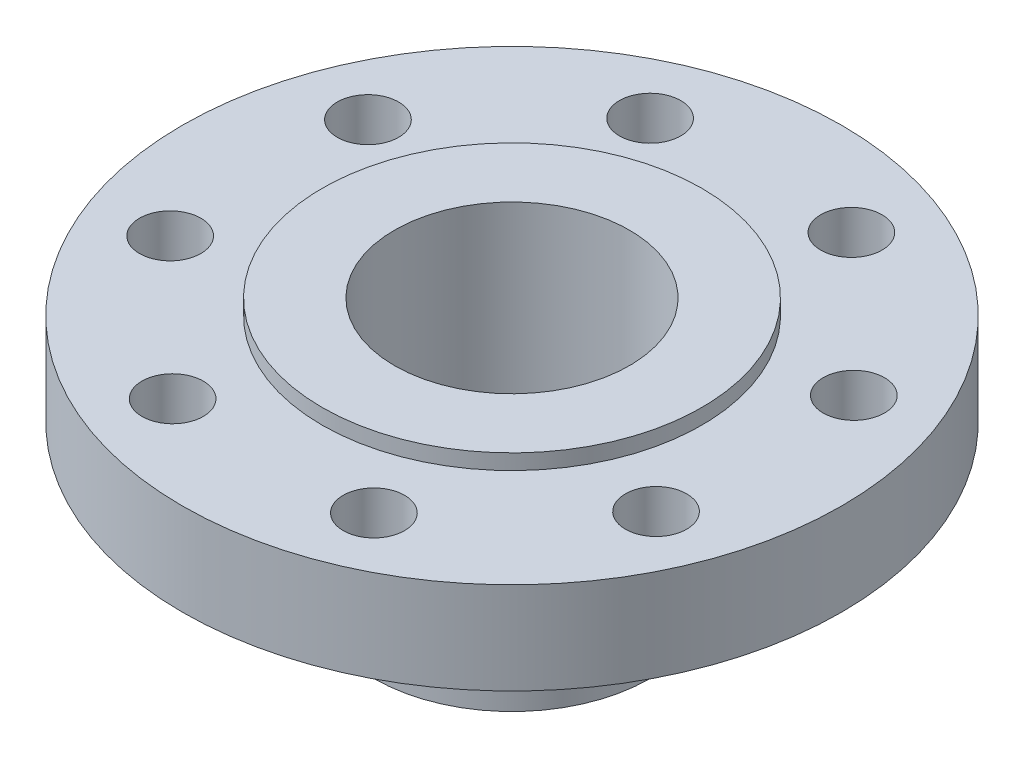
ISO-10303-21;
HEADER;
FILE_DESCRIPTION(('STEP AP214'),'2;1');
FILE_NAME('part.step','',(''),(''),'','','');
FILE_SCHEMA(('AUTOMOTIVE_DESIGN { 1 0 10303 214 1 1 1 1 }'));
ENDSEC;
DATA;
#1=APPLICATION_CONTEXT('core data for automotive mechanical design processes');
#2=APPLICATION_PROTOCOL_DEFINITION('international standard','automotive_design',2000,#1);
#3=PRODUCT_CONTEXT('',#1,'mechanical');
#4=PRODUCT('Part','Part','',(#3));
#5=PRODUCT_RELATED_PRODUCT_CATEGORY('part','',(#4));
#6=PRODUCT_DEFINITION_FORMATION('','',#4);
#7=PRODUCT_DEFINITION_CONTEXT('part definition',#1,'design');
#8=PRODUCT_DEFINITION('design','',#6,#7);
#9=PRODUCT_DEFINITION_SHAPE('','',#8);
#10=(LENGTH_UNIT() NAMED_UNIT(*) SI_UNIT(.MILLI.,.METRE.));
#11=(NAMED_UNIT(*) PLANE_ANGLE_UNIT() SI_UNIT($,.RADIAN.));
#12=(NAMED_UNIT(*) SI_UNIT($,.STERADIAN.) SOLID_ANGLE_UNIT());
#13=UNCERTAINTY_MEASURE_WITH_UNIT(LENGTH_MEASURE(1.E-05),#10,'distance_accuracy_value','');
#14=(GEOMETRIC_REPRESENTATION_CONTEXT(3) GLOBAL_UNCERTAINTY_ASSIGNED_CONTEXT((#13)) GLOBAL_UNIT_ASSIGNED_CONTEXT((#10,
#11,#12)) REPRESENTATION_CONTEXT('',''));
#15=CARTESIAN_POINT('',(0.,0.,0.));
#16=DIRECTION('',(0.,0.,1.));
#17=DIRECTION('',(1.,0.,0.));
#18=AXIS2_PLACEMENT_3D('',#15,#16,#17);
#19=CARTESIAN_POINT('',(57.15,0.,0.));
#20=DIRECTION('',(0.,1.,0.));
#21=DIRECTION('',(0.,0.,1.));
#22=AXIS2_PLACEMENT_3D('',#19,#20,#21);
#23=PLANE('',#22);
#24=CARTESIAN_POINT('',(0.,0.,0.));
#25=DIRECTION('',(0.,1.,0.));
#26=DIRECTION('',(0.,0.,1.));
#27=AXIS2_PLACEMENT_3D('',#24,#25,#26);
#28=CIRCLE('',#27,57.15);
#29=CARTESIAN_POINT('',(0.,0.,57.15));
#30=VERTEX_POINT('',#29);
#31=EDGE_CURVE('E75',#30,#30,#28,.T.);
#32=ORIENTED_EDGE('',*,*,#31,.F.);
#33=EDGE_LOOP('',(#32));
#34=FACE_BOUND('',#33,.T.);
#35=CARTESIAN_POINT('',(0.,0.,0.));
#36=DIRECTION('',(0.,1.,0.));
#37=DIRECTION('',(0.,0.,1.));
#38=AXIS2_PLACEMENT_3D('',#35,#36,#37);
#39=CIRCLE('',#38,48.64);
#40=CARTESIAN_POINT('',(0.,0.,48.64));
#41=VERTEX_POINT('',#40);
#42=EDGE_CURVE('E10',#41,#41,#39,.T.);
#43=ORIENTED_EDGE('',*,*,#42,.T.);
#44=EDGE_LOOP('',(#43));
#45=FACE_BOUND('',#44,.T.);
#46=ADVANCED_FACE('F36',(#34,#45),#23,.F.);
#47=CARTESIAN_POINT('',(0.,145.426192893401,0.));
#48=DIRECTION('',(0.,1.,0.));
#49=DIRECTION('',(0.,0.,1.));
#50=AXIS2_PLACEMENT_3D('',#47,#48,#49);
#51=CYLINDRICAL_SURFACE('',#50,48.64);
#52=ORIENTED_EDGE('',*,*,#42,.F.);
#53=EDGE_LOOP('',(#52));
#54=FACE_BOUND('',#53,.T.);
#55=CARTESIAN_POINT('',(0.,107.95,0.));
#56=DIRECTION('',(0.,1.,0.));
#57=DIRECTION('',(0.,0.,1.));
#58=AXIS2_PLACEMENT_3D('',#55,#56,#57);
#59=CIRCLE('',#58,48.64);
#60=CARTESIAN_POINT('',(0.,107.95,48.64));
#61=VERTEX_POINT('',#60);
#62=EDGE_CURVE('E43',#61,#61,#59,.T.);
#63=ORIENTED_EDGE('',*,*,#62,.T.);
#64=EDGE_LOOP('',(#63));
#65=FACE_BOUND('',#64,.T.);
#66=ADVANCED_FACE('F146',(#54,#65),#51,.F.);
#67=CARTESIAN_POINT('',(48.64,107.95,0.));
#68=DIRECTION('',(0.,-1.,0.));
#69=DIRECTION('',(0.,0.,-1.));
#70=AXIS2_PLACEMENT_3D('',#67,#68,#69);
#71=PLANE('',#70);
#72=ORIENTED_EDGE('',*,*,#62,.F.);
#73=EDGE_LOOP('',(#72));
#74=FACE_BOUND('',#73,.T.);
#75=CARTESIAN_POINT('',(0.,107.95,0.));
#76=DIRECTION('',(0.,1.,0.));
#77=DIRECTION('',(0.,0.,1.));
#78=AXIS2_PLACEMENT_3D('',#75,#76,#77);
#79=CIRCLE('',#78,78.615);
#80=CARTESIAN_POINT('',(0.,107.95,78.615));
#81=VERTEX_POINT('',#80);
#82=EDGE_CURVE('E48',#81,#81,#79,.T.);
#83=ORIENTED_EDGE('',*,*,#82,.T.);
#84=EDGE_LOOP('',(#83));
#85=FACE_BOUND('',#84,.T.);
#86=ADVANCED_FACE('F102',(#74,#85),#71,.F.);
#87=CARTESIAN_POINT('',(0.,145.426192893401,0.));
#88=DIRECTION('',(0.,1.,0.));
#89=DIRECTION('',(0.,0.,1.));
#90=AXIS2_PLACEMENT_3D('',#87,#88,#89);
#91=CYLINDRICAL_SURFACE('',#90,78.615);
#92=ORIENTED_EDGE('',*,*,#82,.F.);
#93=EDGE_LOOP('',(#92));
#94=FACE_BOUND('',#93,.T.);
#95=CARTESIAN_POINT('',(0.,101.6,0.));
#96=DIRECTION('',(0.,1.,0.));
#97=DIRECTION('',(0.,0.,1.));
#98=AXIS2_PLACEMENT_3D('',#95,#96,#97);
#99=CIRCLE('',#98,78.615);
#100=CARTESIAN_POINT('',(0.,101.6,78.615));
#101=VERTEX_POINT('',#100);
#102=EDGE_CURVE('E97',#101,#101,#99,.T.);
#103=ORIENTED_EDGE('',*,*,#102,.T.);
#104=EDGE_LOOP('',(#103));
#105=FACE_BOUND('',#104,.T.);
#106=ADVANCED_FACE('F104',(#94,#105),#91,.T.);
#107=CARTESIAN_POINT('',(78.615,101.6,0.));
#108=DIRECTION('',(0.,-1.,0.));
#109=DIRECTION('',(0.,0.,-1.));
#110=AXIS2_PLACEMENT_3D('',#107,#108,#109);
#111=PLANE('',#110);
#112=CARTESIAN_POINT('',(-100.089497100485,101.6,-40.4387817592463));
#113=DIRECTION('',(0.,1.,0.));
#114=DIRECTION('',(0.,0.,1.));
#115=AXIS2_PLACEMENT_3D('',#112,#113,#114);
#116=CIRCLE('',#115,12.7000000000027);
#117=CARTESIAN_POINT('',(-100.089497100485,101.6,-27.7387817592436));
#118=VERTEX_POINT('',#117);
#119=EDGE_CURVE('E268',#118,#118,#116,.T.);
#120=ORIENTED_EDGE('',*,*,#119,.F.);
#121=EDGE_LOOP('',(#120));
#122=FACE_BOUND('',#121,.T.);
#123=CARTESIAN_POINT('',(-99.3684989301908,101.6,42.1794253204198));
#124=DIRECTION('',(0.,1.,0.));
#125=DIRECTION('',(0.,0.,1.));
#126=AXIS2_PLACEMENT_3D('',#123,#124,#125);
#127=CIRCLE('',#126,12.7000000000036);
#128=CARTESIAN_POINT('',(-99.3684989301908,101.6,54.8794253204234));
#129=VERTEX_POINT('',#128);
#130=EDGE_CURVE('E269',#129,#129,#127,.T.);
#131=ORIENTED_EDGE('',*,*,#130,.F.);
#132=EDGE_LOOP('',(#131));
#133=FACE_BOUND('',#132,.T.);
#134=CARTESIAN_POINT('',(-40.4387817592463,101.6,100.089497100488));
#135=DIRECTION('',(0.,1.,0.));
#136=DIRECTION('',(0.,0.,1.));
#137=AXIS2_PLACEMENT_3D('',#134,#135,#136);
#138=CIRCLE('',#137,12.7000000000036);
#139=CARTESIAN_POINT('',(-40.4387817592463,101.6,112.789497100491));
#140=VERTEX_POINT('',#139);
#141=EDGE_CURVE('E271',#140,#140,#138,.T.);
#142=ORIENTED_EDGE('',*,*,#141,.F.);
#143=EDGE_LOOP('',(#142));
#144=FACE_BOUND('',#143,.T.);
#145=CARTESIAN_POINT('',(42.1794253204198,101.6,99.3684989301934));
#146=DIRECTION('',(0.,1.,0.));
#147=DIRECTION('',(0.,0.,1.));
#148=AXIS2_PLACEMENT_3D('',#145,#146,#147);
#149=CIRCLE('',#148,12.7000000000025);
#150=CARTESIAN_POINT('',(42.1794253204198,101.6,112.068498930196));
#151=VERTEX_POINT('',#150);
#152=EDGE_CURVE('E276',#151,#151,#149,.T.);
#153=ORIENTED_EDGE('',*,*,#152,.F.);
#154=EDGE_LOOP('',(#153));
#155=FACE_BOUND('',#154,.T.);
#156=CARTESIAN_POINT('',(100.089497100488,101.6,40.4387817592488));
#157=DIRECTION('',(0.,1.,0.));
#158=DIRECTION('',(0.,0.,1.));
#159=AXIS2_PLACEMENT_3D('',#156,#157,#158);
#160=CIRCLE('',#159,12.7000000000009);
#161=CARTESIAN_POINT('',(100.089497100488,101.6,53.1387817592498));
#162=VERTEX_POINT('',#161);
#163=EDGE_CURVE('E279',#162,#162,#160,.T.);
#164=ORIENTED_EDGE('',*,*,#163,.F.);
#165=EDGE_LOOP('',(#164));
#166=FACE_BOUND('',#165,.T.);
#167=CARTESIAN_POINT('',(99.3684989301935,101.6,-42.1794253204172));
#168=DIRECTION('',(0.,1.,0.));
#169=DIRECTION('',(0.,0.,1.));
#170=AXIS2_PLACEMENT_3D('',#167,#168,#169);
#171=CIRCLE('',#170,12.6999999999997);
#172=CARTESIAN_POINT('',(99.3684989301935,101.6,-29.4794253204176));
#173=VERTEX_POINT('',#172);
#174=EDGE_CURVE('E282',#173,#173,#171,.T.);
#175=ORIENTED_EDGE('',*,*,#174,.F.);
#176=EDGE_LOOP('',(#175));
#177=FACE_BOUND('',#176,.T.);
#178=CARTESIAN_POINT('',(40.4387817592489,101.6,-100.089497100485));
#179=DIRECTION('',(0.,1.,0.));
#180=DIRECTION('',(0.,0.,1.));
#181=AXIS2_PLACEMENT_3D('',#178,#179,#180);
#182=CIRCLE('',#181,12.6999999999993);
#183=CARTESIAN_POINT('',(40.4387817592489,101.6,-87.389497100486));
#184=VERTEX_POINT('',#183);
#185=EDGE_CURVE('E285',#184,#184,#182,.T.);
#186=ORIENTED_EDGE('',*,*,#185,.F.);
#187=EDGE_LOOP('',(#186));
#188=FACE_BOUND('',#187,.T.);
#189=CARTESIAN_POINT('',(-42.1794253204172,101.6,-99.3684989301909));
#190=DIRECTION('',(0.,1.,0.));
#191=DIRECTION('',(0.,0.,1.));
#192=AXIS2_PLACEMENT_3D('',#189,#190,#191);
#193=CIRCLE('',#192,12.7);
#194=CARTESIAN_POINT('',(-42.1794253204172,101.6,-86.6684989301909));
#195=VERTEX_POINT('',#194);
#196=EDGE_CURVE('E56',#195,#195,#193,.T.);
#197=ORIENTED_EDGE('',*,*,#196,.F.);
#198=EDGE_LOOP('',(#197));
#199=FACE_BOUND('',#198,.T.);
#200=ORIENTED_EDGE('',*,*,#102,.F.);
#201=EDGE_LOOP('',(#200));
#202=FACE_BOUND('',#201,.T.);
#203=CARTESIAN_POINT('',(0.,101.6,0.));
#204=DIRECTION('',(0.,1.,0.));
#205=DIRECTION('',(0.,0.,1.));
#206=AXIS2_PLACEMENT_3D('',#203,#204,#205);
#207=CIRCLE('',#206,136.525);
#208=CARTESIAN_POINT('',(0.,101.6,136.525));
#209=VERTEX_POINT('',#208);
#210=EDGE_CURVE('E94',#209,#209,#207,.T.);
#211=ORIENTED_EDGE('',*,*,#210,.T.);
#212=EDGE_LOOP('',(#211));
#213=FACE_BOUND('',#212,.T.);
#214=ADVANCED_FACE('F107',(#122,#133,#144,#155,#166,#177,#188,#199,#202,#213),#111,.F.);
#215=CARTESIAN_POINT('',(0.,145.426192893401,0.));
#216=DIRECTION('',(0.,1.,0.));
#217=DIRECTION('',(0.,0.,1.));
#218=AXIS2_PLACEMENT_3D('',#215,#216,#217);
#219=CYLINDRICAL_SURFACE('',#218,136.525);
#220=ORIENTED_EDGE('',*,*,#210,.F.);
#221=EDGE_LOOP('',(#220));
#222=FACE_BOUND('',#221,.T.);
#223=CARTESIAN_POINT('',(0.,63.5,0.));
#224=DIRECTION('',(0.,1.,0.));
#225=DIRECTION('',(0.,0.,1.));
#226=AXIS2_PLACEMENT_3D('',#223,#224,#225);
#227=CIRCLE('',#226,136.525);
#228=CARTESIAN_POINT('',(0.,63.5,136.525));
#229=VERTEX_POINT('',#228);
#230=EDGE_CURVE('E91',#229,#229,#227,.T.);
#231=ORIENTED_EDGE('',*,*,#230,.T.);
#232=EDGE_LOOP('',(#231));
#233=FACE_BOUND('',#232,.T.);
#234=ADVANCED_FACE('F113',(#222,#233),#219,.T.);
#235=CARTESIAN_POINT('',(136.525,63.5,0.));
#236=DIRECTION('',(0.,1.,0.));
#237=DIRECTION('',(0.,0.,1.));
#238=AXIS2_PLACEMENT_3D('',#235,#236,#237);
#239=PLANE('',#238);
#240=CARTESIAN_POINT('',(-100.089497100485,63.5,-40.4387817592463));
#241=DIRECTION('',(0.,1.,0.));
#242=DIRECTION('',(0.,0.,1.));
#243=AXIS2_PLACEMENT_3D('',#240,#241,#242);
#244=CIRCLE('',#243,12.7000000000027);
#245=CARTESIAN_POINT('',(-100.089497100485,63.5,-27.7387817592436));
#246=VERTEX_POINT('',#245);
#247=EDGE_CURVE('E39',#246,#246,#244,.T.);
#248=ORIENTED_EDGE('',*,*,#247,.T.);
#249=EDGE_LOOP('',(#248));
#250=FACE_BOUND('',#249,.T.);
#251=CARTESIAN_POINT('',(-99.3684989301908,63.5,42.1794253204198));
#252=DIRECTION('',(0.,1.,0.));
#253=DIRECTION('',(0.,0.,1.));
#254=AXIS2_PLACEMENT_3D('',#251,#252,#253);
#255=CIRCLE('',#254,12.7000000000036);
#256=CARTESIAN_POINT('',(-99.3684989301908,63.5,54.8794253204234));
#257=VERTEX_POINT('',#256);
#258=EDGE_CURVE('E70',#257,#257,#255,.T.);
#259=ORIENTED_EDGE('',*,*,#258,.T.);
#260=EDGE_LOOP('',(#259));
#261=FACE_BOUND('',#260,.T.);
#262=CARTESIAN_POINT('',(-40.4387817592463,63.5,100.089497100488));
#263=DIRECTION('',(0.,1.,0.));
#264=DIRECTION('',(0.,0.,1.));
#265=AXIS2_PLACEMENT_3D('',#262,#263,#264);
#266=CIRCLE('',#265,12.7000000000036);
#267=CARTESIAN_POINT('',(-40.4387817592463,63.5,112.789497100491));
#268=VERTEX_POINT('',#267);
#269=EDGE_CURVE('E68',#268,#268,#266,.T.);
#270=ORIENTED_EDGE('',*,*,#269,.T.);
#271=EDGE_LOOP('',(#270));
#272=FACE_BOUND('',#271,.T.);
#273=CARTESIAN_POINT('',(42.1794253204198,63.5,99.3684989301934));
#274=DIRECTION('',(0.,1.,0.));
#275=DIRECTION('',(0.,0.,1.));
#276=AXIS2_PLACEMENT_3D('',#273,#274,#275);
#277=CIRCLE('',#276,12.7000000000025);
#278=CARTESIAN_POINT('',(42.1794253204198,63.5,112.068498930196));
#279=VERTEX_POINT('',#278);
#280=EDGE_CURVE('E65',#279,#279,#277,.T.);
#281=ORIENTED_EDGE('',*,*,#280,.T.);
#282=EDGE_LOOP('',(#281));
#283=FACE_BOUND('',#282,.T.);
#284=CARTESIAN_POINT('',(100.089497100488,63.5,40.4387817592488));
#285=DIRECTION('',(0.,1.,0.));
#286=DIRECTION('',(0.,0.,1.));
#287=AXIS2_PLACEMENT_3D('',#284,#285,#286);
#288=CIRCLE('',#287,12.7000000000009);
#289=CARTESIAN_POINT('',(100.089497100488,63.5,53.1387817592498));
#290=VERTEX_POINT('',#289);
#291=EDGE_CURVE('E62',#290,#290,#288,.T.);
#292=ORIENTED_EDGE('',*,*,#291,.T.);
#293=EDGE_LOOP('',(#292));
#294=FACE_BOUND('',#293,.T.);
#295=CARTESIAN_POINT('',(99.3684989301935,63.5,-42.1794253204172));
#296=DIRECTION('',(0.,1.,0.));
#297=DIRECTION('',(0.,0.,1.));
#298=AXIS2_PLACEMENT_3D('',#295,#296,#297);
#299=CIRCLE('',#298,12.6999999999997);
#300=CARTESIAN_POINT('',(99.3684989301935,63.5,-29.4794253204176));
#301=VERTEX_POINT('',#300);
#302=EDGE_CURVE('E59',#301,#301,#299,.T.);
#303=ORIENTED_EDGE('',*,*,#302,.T.);
#304=EDGE_LOOP('',(#303));
#305=FACE_BOUND('',#304,.T.);
#306=CARTESIAN_POINT('',(40.4387817592489,63.5,-100.089497100485));
#307=DIRECTION('',(0.,1.,0.));
#308=DIRECTION('',(0.,0.,1.));
#309=AXIS2_PLACEMENT_3D('',#306,#307,#308);
#310=CIRCLE('',#309,12.6999999999993);
#311=CARTESIAN_POINT('',(40.4387817592489,63.5,-87.389497100486));
#312=VERTEX_POINT('',#311);
#313=EDGE_CURVE('E55',#312,#312,#310,.T.);
#314=ORIENTED_EDGE('',*,*,#313,.T.);
#315=EDGE_LOOP('',(#314));
#316=FACE_BOUND('',#315,.T.);
#317=CARTESIAN_POINT('',(-42.1794253204172,63.5,-99.3684989301909));
#318=DIRECTION('',(0.,1.,0.));
#319=DIRECTION('',(0.,0.,1.));
#320=AXIS2_PLACEMENT_3D('',#317,#318,#319);
#321=CIRCLE('',#320,12.7);
#322=CARTESIAN_POINT('',(-42.1794253204172,63.5,-86.6684989301909));
#323=VERTEX_POINT('',#322);
#324=EDGE_CURVE('E52',#323,#323,#321,.T.);
#325=ORIENTED_EDGE('',*,*,#324,.T.);
#326=EDGE_LOOP('',(#325));
#327=FACE_BOUND('',#326,.T.);
#328=ORIENTED_EDGE('',*,*,#230,.F.);
#329=EDGE_LOOP('',(#328));
#330=FACE_BOUND('',#329,.T.);
#331=CARTESIAN_POINT('',(0.,63.5,0.));
#332=DIRECTION('',(0.,1.,0.));
#333=DIRECTION('',(0.,0.,1.));
#334=AXIS2_PLACEMENT_3D('',#331,#332,#333);
#335=CIRCLE('',#334,78.615);
#336=CARTESIAN_POINT('',(0.,63.5,78.615));
#337=VERTEX_POINT('',#336);
#338=EDGE_CURVE('E84',#337,#337,#335,.T.);
#339=ORIENTED_EDGE('',*,*,#338,.T.);
#340=EDGE_LOOP('',(#339));
#341=FACE_BOUND('',#340,.T.);
#342=ADVANCED_FACE('F120',(#250,#261,#272,#283,#294,#305,#316,#327,#330,#341),#239,.F.);
#343=CARTESIAN_POINT('',(0.,11.29,0.));
#344=DIRECTION('',(0.,1.,0.));
#345=DIRECTION('',(0.,0.,1.));
#346=AXIS2_PLACEMENT_3D('',#343,#344,#345);
#347=CONICAL_SURFACE('',#346,57.15,0.390062635975593);
#348=ORIENTED_EDGE('',*,*,#338,.F.);
#349=EDGE_LOOP('',(#348));
#350=FACE_BOUND('',#349,.T.);
#351=CARTESIAN_POINT('',(0.,11.29,0.));
#352=DIRECTION('',(0.,1.,0.));
#353=DIRECTION('',(0.,0.,1.));
#354=AXIS2_PLACEMENT_3D('',#351,#352,#353);
#355=CIRCLE('',#354,57.15);
#356=CARTESIAN_POINT('',(0.,11.29,57.15));
#357=VERTEX_POINT('',#356);
#358=EDGE_CURVE('E79',#357,#357,#355,.T.);
#359=ORIENTED_EDGE('',*,*,#358,.T.);
#360=EDGE_LOOP('',(#359));
#361=FACE_BOUND('',#360,.T.);
#362=ADVANCED_FACE('F126',(#350,#361),#347,.T.);
#363=CARTESIAN_POINT('',(0.,145.426192893401,0.));
#364=DIRECTION('',(0.,1.,0.));
#365=DIRECTION('',(0.,0.,1.));
#366=AXIS2_PLACEMENT_3D('',#363,#364,#365);
#367=CYLINDRICAL_SURFACE('',#366,57.15);
#368=ORIENTED_EDGE('',*,*,#358,.F.);
#369=EDGE_LOOP('',(#368));
#370=FACE_BOUND('',#369,.T.);
#371=ORIENTED_EDGE('',*,*,#31,.T.);
#372=EDGE_LOOP('',(#371));
#373=FACE_BOUND('',#372,.T.);
#374=ADVANCED_FACE('F132',(#370,#373),#367,.T.);
#375=CARTESIAN_POINT('',(-42.1794253204172,48.6,-99.3684989301909));
#376=DIRECTION('',(0.,1.,0.));
#377=DIRECTION('',(0.,0.,1.));
#378=AXIS2_PLACEMENT_3D('',#375,#376,#377);
#379=CYLINDRICAL_SURFACE('',#378,12.7);
#380=ORIENTED_EDGE('',*,*,#196,.T.);
#381=EDGE_LOOP('',(#380));
#382=FACE_BOUND('',#381,.T.);
#383=ORIENTED_EDGE('',*,*,#324,.F.);
#384=EDGE_LOOP('',(#383));
#385=FACE_BOUND('',#384,.T.);
#386=ADVANCED_FACE('F137',(#382,#385),#379,.F.);
#387=CARTESIAN_POINT('',(40.4387817592489,48.6,-100.089497100485));
#388=DIRECTION('',(0.,1.,0.));
#389=DIRECTION('',(0.,0.,1.));
#390=AXIS2_PLACEMENT_3D('',#387,#388,#389);
#391=CYLINDRICAL_SURFACE('',#390,12.6999999999993);
#392=ORIENTED_EDGE('',*,*,#185,.T.);
#393=EDGE_LOOP('',(#392));
#394=FACE_BOUND('',#393,.T.);
#395=ORIENTED_EDGE('',*,*,#313,.F.);
#396=EDGE_LOOP('',(#395));
#397=FACE_BOUND('',#396,.T.);
#398=ADVANCED_FACE('F142',(#394,#397),#391,.F.);
#399=CARTESIAN_POINT('',(99.3684989301935,48.6,-42.1794253204172));
#400=DIRECTION('',(0.,1.,0.));
#401=DIRECTION('',(0.,0.,1.));
#402=AXIS2_PLACEMENT_3D('',#399,#400,#401);
#403=CYLINDRICAL_SURFACE('',#402,12.6999999999997);
#404=ORIENTED_EDGE('',*,*,#174,.T.);
#405=EDGE_LOOP('',(#404));
#406=FACE_BOUND('',#405,.T.);
#407=ORIENTED_EDGE('',*,*,#302,.F.);
#408=EDGE_LOOP('',(#407));
#409=FACE_BOUND('',#408,.T.);
#410=ADVANCED_FACE('F201',(#406,#409),#403,.F.);
#411=CARTESIAN_POINT('',(100.089497100488,48.6,40.4387817592488));
#412=DIRECTION('',(0.,1.,0.));
#413=DIRECTION('',(0.,0.,1.));
#414=AXIS2_PLACEMENT_3D('',#411,#412,#413);
#415=CYLINDRICAL_SURFACE('',#414,12.7000000000009);
#416=ORIENTED_EDGE('',*,*,#163,.T.);
#417=EDGE_LOOP('',(#416));
#418=FACE_BOUND('',#417,.T.);
#419=ORIENTED_EDGE('',*,*,#291,.F.);
#420=EDGE_LOOP('',(#419));
#421=FACE_BOUND('',#420,.T.);
#422=ADVANCED_FACE('F210',(#418,#421),#415,.F.);
#423=CARTESIAN_POINT('',(42.1794253204198,48.6,99.3684989301934));
#424=DIRECTION('',(0.,1.,0.));
#425=DIRECTION('',(0.,0.,1.));
#426=AXIS2_PLACEMENT_3D('',#423,#424,#425);
#427=CYLINDRICAL_SURFACE('',#426,12.7000000000025);
#428=ORIENTED_EDGE('',*,*,#152,.T.);
#429=EDGE_LOOP('',(#428));
#430=FACE_BOUND('',#429,.T.);
#431=ORIENTED_EDGE('',*,*,#280,.F.);
#432=EDGE_LOOP('',(#431));
#433=FACE_BOUND('',#432,.T.);
#434=ADVANCED_FACE('F219',(#430,#433),#427,.F.);
#435=CARTESIAN_POINT('',(-40.4387817592463,48.6,100.089497100488));
#436=DIRECTION('',(0.,1.,0.));
#437=DIRECTION('',(0.,0.,1.));
#438=AXIS2_PLACEMENT_3D('',#435,#436,#437);
#439=CYLINDRICAL_SURFACE('',#438,12.7000000000036);
#440=ORIENTED_EDGE('',*,*,#141,.T.);
#441=EDGE_LOOP('',(#440));
#442=FACE_BOUND('',#441,.T.);
#443=ORIENTED_EDGE('',*,*,#269,.F.);
#444=EDGE_LOOP('',(#443));
#445=FACE_BOUND('',#444,.T.);
#446=ADVANCED_FACE('F228',(#442,#445),#439,.F.);
#447=CARTESIAN_POINT('',(-99.3684989301908,48.6,42.1794253204198));
#448=DIRECTION('',(0.,1.,0.));
#449=DIRECTION('',(0.,0.,1.));
#450=AXIS2_PLACEMENT_3D('',#447,#448,#449);
#451=CYLINDRICAL_SURFACE('',#450,12.7000000000036);
#452=ORIENTED_EDGE('',*,*,#130,.T.);
#453=EDGE_LOOP('',(#452));
#454=FACE_BOUND('',#453,.T.);
#455=ORIENTED_EDGE('',*,*,#258,.F.);
#456=EDGE_LOOP('',(#455));
#457=FACE_BOUND('',#456,.T.);
#458=ADVANCED_FACE('F237',(#454,#457),#451,.F.);
#459=CARTESIAN_POINT('',(-100.089497100485,48.6,-40.4387817592463));
#460=DIRECTION('',(0.,1.,0.));
#461=DIRECTION('',(0.,0.,1.));
#462=AXIS2_PLACEMENT_3D('',#459,#460,#461);
#463=CYLINDRICAL_SURFACE('',#462,12.7000000000027);
#464=ORIENTED_EDGE('',*,*,#119,.T.);
#465=EDGE_LOOP('',(#464));
#466=FACE_BOUND('',#465,.T.);
#467=ORIENTED_EDGE('',*,*,#247,.F.);
#468=EDGE_LOOP('',(#467));
#469=FACE_BOUND('',#468,.T.);
#470=ADVANCED_FACE('F246',(#466,#469),#463,.F.);
#471=CLOSED_SHELL('',(#46,#66,#86,#106,#214,#234,#342,#362,#374,#386,#398,#410,#422,#434,#446,
#458,#470));
#472=MANIFOLD_SOLID_BREP('B2',#471);
#473=ADVANCED_BREP_SHAPE_REPRESENTATION('',(#18,#472),#14);
#474=SHAPE_DEFINITION_REPRESENTATION(#9,#473);
ENDSEC;
END-ISO-10303-21;
